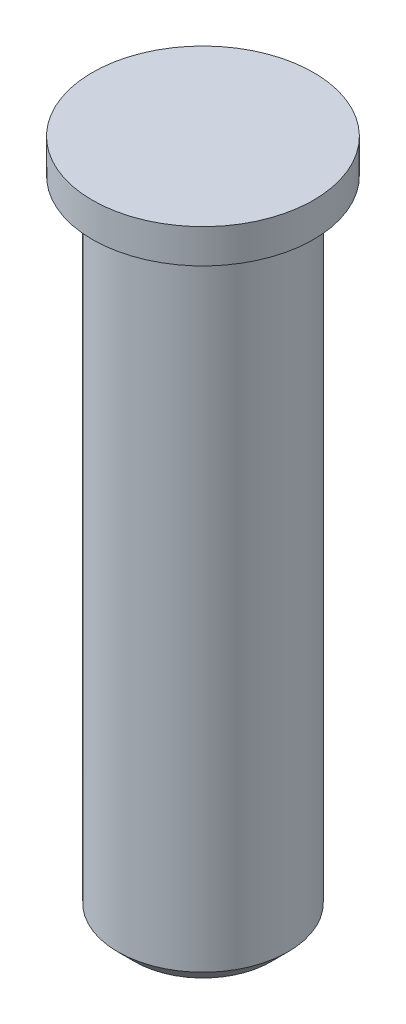
ISO-10303-21;
HEADER;
FILE_DESCRIPTION(('STEP AP214'),'2;1');
FILE_NAME('part.step','',(''),(''),'','','');
FILE_SCHEMA(('AUTOMOTIVE_DESIGN { 1 0 10303 214 1 1 1 1 }'));
ENDSEC;
DATA;
#1=APPLICATION_CONTEXT('core data for automotive mechanical design processes');
#2=APPLICATION_PROTOCOL_DEFINITION('international standard','automotive_design',2000,#1);
#3=PRODUCT_CONTEXT('',#1,'mechanical');
#4=PRODUCT('Part','Part','',(#3));
#5=PRODUCT_RELATED_PRODUCT_CATEGORY('part','',(#4));
#6=PRODUCT_DEFINITION_FORMATION('','',#4);
#7=PRODUCT_DEFINITION_CONTEXT('part definition',#1,'design');
#8=PRODUCT_DEFINITION('design','',#6,#7);
#9=PRODUCT_DEFINITION_SHAPE('','',#8);
#10=(LENGTH_UNIT() NAMED_UNIT(*) SI_UNIT(.MILLI.,.METRE.));
#11=(NAMED_UNIT(*) PLANE_ANGLE_UNIT() SI_UNIT($,.RADIAN.));
#12=(NAMED_UNIT(*) SI_UNIT($,.STERADIAN.) SOLID_ANGLE_UNIT());
#13=UNCERTAINTY_MEASURE_WITH_UNIT(LENGTH_MEASURE(1.E-05),#10,'distance_accuracy_value','');
#14=(GEOMETRIC_REPRESENTATION_CONTEXT(3) GLOBAL_UNCERTAINTY_ASSIGNED_CONTEXT((#13)) GLOBAL_UNIT_ASSIGNED_CONTEXT((#10,
#11,#12)) REPRESENTATION_CONTEXT('',''));
#15=CARTESIAN_POINT('',(0.,0.,0.));
#16=DIRECTION('',(0.,0.,1.));
#17=DIRECTION('',(1.,0.,0.));
#18=AXIS2_PLACEMENT_3D('',#15,#16,#17);
#19=CARTESIAN_POINT('',(0.,0.,0.));
#20=DIRECTION('',(0.,-1.,0.));
#21=DIRECTION('',(0.,0.,-1.));
#22=AXIS2_PLACEMENT_3D('',#19,#20,#21);
#23=PLANE('',#22);
#24=CARTESIAN_POINT('',(0.,0.,0.));
#25=DIRECTION('',(0.,1.,0.));
#26=DIRECTION('',(0.,0.,1.));
#27=AXIS2_PLACEMENT_3D('',#24,#25,#26);
#28=CIRCLE('',#27,3.25);
#29=CARTESIAN_POINT('',(0.,0.,3.25));
#30=VERTEX_POINT('',#29);
#31=EDGE_CURVE('E44',#30,#30,#28,.T.);
#32=ORIENTED_EDGE('',*,*,#31,.T.);
#33=EDGE_LOOP('',(#32));
#34=FACE_BOUND('',#33,.T.);
#35=ADVANCED_FACE('F33',(#34),#23,.F.);
#36=CARTESIAN_POINT('',(0.,0.,0.));
#37=DIRECTION('',(0.,1.,0.));
#38=DIRECTION('',(0.,0.,1.));
#39=AXIS2_PLACEMENT_3D('',#36,#37,#38);
#40=CYLINDRICAL_SURFACE('',#39,3.25);
#41=ORIENTED_EDGE('',*,*,#31,.F.);
#42=EDGE_LOOP('',(#41));
#43=FACE_BOUND('',#42,.T.);
#44=CARTESIAN_POINT('',(0.,-1.,0.));
#45=DIRECTION('',(0.,1.,0.));
#46=DIRECTION('',(0.,0.,1.));
#47=AXIS2_PLACEMENT_3D('',#44,#45,#46);
#48=CIRCLE('',#47,3.25);
#49=CARTESIAN_POINT('',(0.,-1.,3.25));
#50=VERTEX_POINT('',#49);
#51=EDGE_CURVE('E48',#50,#50,#48,.T.);
#52=ORIENTED_EDGE('',*,*,#51,.T.);
#53=EDGE_LOOP('',(#52));
#54=FACE_BOUND('',#53,.T.);
#55=ADVANCED_FACE('F68',(#43,#54),#40,.T.);
#56=CARTESIAN_POINT('',(3.25,-1.,0.));
#57=DIRECTION('',(0.,1.,0.));
#58=DIRECTION('',(0.,0.,1.));
#59=AXIS2_PLACEMENT_3D('',#56,#57,#58);
#60=PLANE('',#59);
#61=ORIENTED_EDGE('',*,*,#51,.F.);
#62=EDGE_LOOP('',(#61));
#63=FACE_BOUND('',#62,.T.);
#64=CARTESIAN_POINT('',(0.,-1.,0.));
#65=DIRECTION('',(0.,1.,0.));
#66=DIRECTION('',(0.,0.,1.));
#67=AXIS2_PLACEMENT_3D('',#64,#65,#66);
#68=CIRCLE('',#67,2.5);
#69=CARTESIAN_POINT('',(0.,-1.,2.5));
#70=VERTEX_POINT('',#69);
#71=EDGE_CURVE('E53',#70,#70,#68,.T.);
#72=ORIENTED_EDGE('',*,*,#71,.T.);
#73=EDGE_LOOP('',(#72));
#74=FACE_BOUND('',#73,.T.);
#75=ADVANCED_FACE('F57',(#63,#74),#60,.F.);
#76=CARTESIAN_POINT('',(0.,0.,0.));
#77=DIRECTION('',(0.,1.,0.));
#78=DIRECTION('',(0.,0.,1.));
#79=AXIS2_PLACEMENT_3D('',#76,#77,#78);
#80=CYLINDRICAL_SURFACE('',#79,2.5);
#81=CARTESIAN_POINT('',(0.,-19.5,0.));
#82=DIRECTION('',(0.,1.,0.));
#83=DIRECTION('',(0.,0.,1.));
#84=AXIS2_PLACEMENT_3D('',#81,#82,#83);
#85=CIRCLE('',#84,2.5);
#86=CARTESIAN_POINT('',(0.,-19.5,2.5));
#87=VERTEX_POINT('',#86);
#88=EDGE_CURVE('E40',#87,#87,#85,.T.);
#89=ORIENTED_EDGE('',*,*,#88,.T.);
#90=EDGE_LOOP('',(#89));
#91=FACE_BOUND('',#90,.T.);
#92=ORIENTED_EDGE('',*,*,#71,.F.);
#93=EDGE_LOOP('',(#92));
#94=FACE_BOUND('',#93,.T.);
#95=ADVANCED_FACE('F59',(#91,#94),#80,.T.);
#96=CARTESIAN_POINT('',(2.5,-20.,0.));
#97=DIRECTION('',(0.,1.,0.));
#98=DIRECTION('',(0.,0.,1.));
#99=AXIS2_PLACEMENT_3D('',#96,#97,#98);
#100=PLANE('',#99);
#101=CARTESIAN_POINT('',(0.,-20.,0.));
#102=DIRECTION('',(0.,1.,0.));
#103=DIRECTION('',(0.,0.,1.));
#104=AXIS2_PLACEMENT_3D('',#101,#102,#103);
#105=CIRCLE('',#104,1.99999999999999);
#106=CARTESIAN_POINT('',(0.,-20.,1.99999999999999));
#107=VERTEX_POINT('',#106);
#108=EDGE_CURVE('E10',#107,#107,#105,.F.);
#109=ORIENTED_EDGE('',*,*,#108,.T.);
#110=EDGE_LOOP('',(#109));
#111=FACE_BOUND('',#110,.T.);
#112=ADVANCED_FACE('F61',(#111),#100,.F.);
#113=CARTESIAN_POINT('',(0.,-19.5,0.));
#114=DIRECTION('',(0.,1.,0.));
#115=DIRECTION('',(0.,0.,1.));
#116=AXIS2_PLACEMENT_3D('',#113,#114,#115);
#117=CONICAL_SURFACE('',#116,2.5,0.785398163397453);
#118=ORIENTED_EDGE('',*,*,#108,.F.);
#119=EDGE_LOOP('',(#118));
#120=FACE_BOUND('',#119,.T.);
#121=ORIENTED_EDGE('',*,*,#88,.F.);
#122=EDGE_LOOP('',(#121));
#123=FACE_BOUND('',#122,.T.);
#124=ADVANCED_FACE('F35',(#120,#123),#117,.T.);
#125=CLOSED_SHELL('',(#35,#55,#75,#95,#112,#124));
#126=MANIFOLD_SOLID_BREP('B2',#125);
#127=ADVANCED_BREP_SHAPE_REPRESENTATION('',(#18,#126),#14);
#128=SHAPE_DEFINITION_REPRESENTATION(#9,#127);
ENDSEC;
END-ISO-10303-21;
